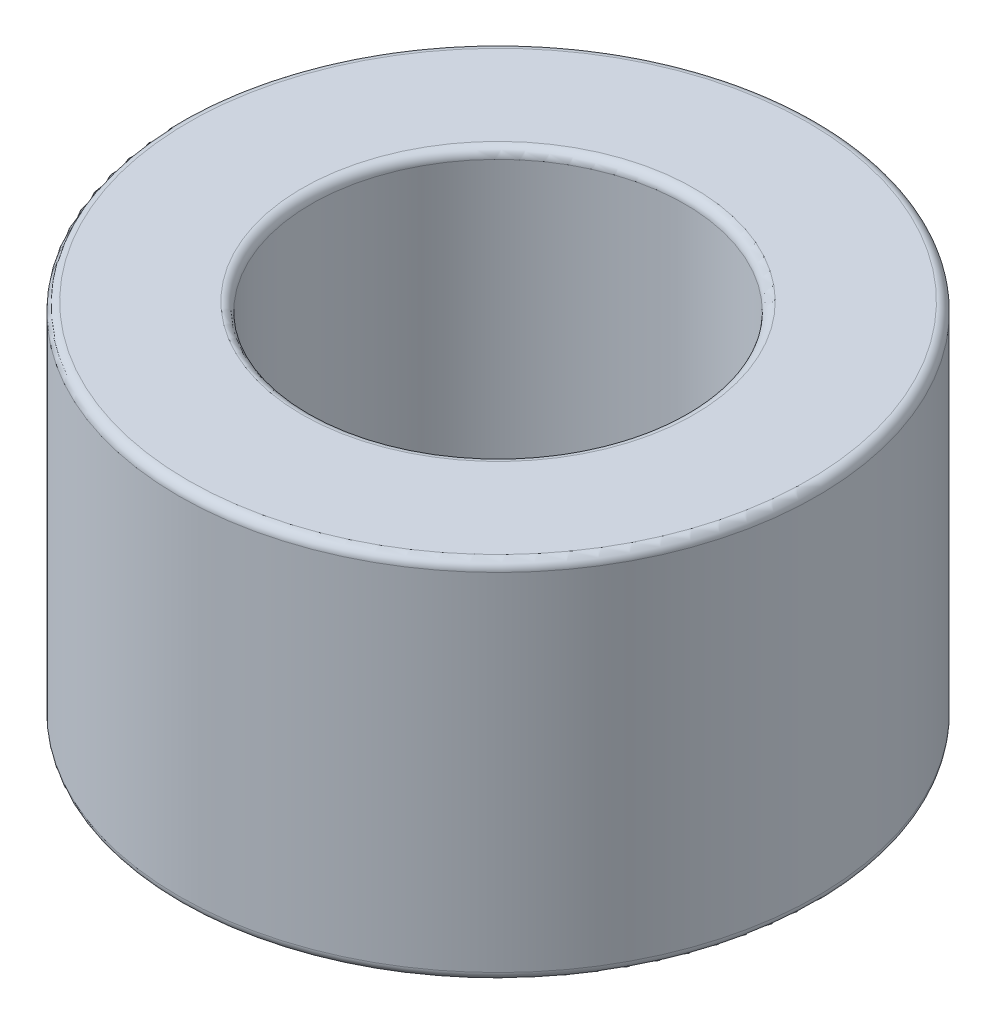
ISO-10303-21;
HEADER;
FILE_DESCRIPTION(('STEP AP214'),'2;1');
FILE_NAME('part.step','',(''),(''),'','','');
FILE_SCHEMA(('AUTOMOTIVE_DESIGN { 1 0 10303 214 1 1 1 1 }'));
ENDSEC;
DATA;
#1=APPLICATION_CONTEXT('core data for automotive mechanical design processes');
#2=APPLICATION_PROTOCOL_DEFINITION('international standard','automotive_design',2000,#1);
#3=PRODUCT_CONTEXT('',#1,'mechanical');
#4=PRODUCT('Part','Part','',(#3));
#5=PRODUCT_RELATED_PRODUCT_CATEGORY('part','',(#4));
#6=PRODUCT_DEFINITION_FORMATION('','',#4);
#7=PRODUCT_DEFINITION_CONTEXT('part definition',#1,'design');
#8=PRODUCT_DEFINITION('design','',#6,#7);
#9=PRODUCT_DEFINITION_SHAPE('','',#8);
#10=(LENGTH_UNIT() NAMED_UNIT(*) SI_UNIT(.MILLI.,.METRE.));
#11=(NAMED_UNIT(*) PLANE_ANGLE_UNIT() SI_UNIT($,.RADIAN.));
#12=(NAMED_UNIT(*) SI_UNIT($,.STERADIAN.) SOLID_ANGLE_UNIT());
#13=UNCERTAINTY_MEASURE_WITH_UNIT(LENGTH_MEASURE(1.E-05),#10,'distance_accuracy_value','');
#14=(GEOMETRIC_REPRESENTATION_CONTEXT(3) GLOBAL_UNCERTAINTY_ASSIGNED_CONTEXT((#13)) GLOBAL_UNIT_ASSIGNED_CONTEXT((#10,
#11,#12)) REPRESENTATION_CONTEXT('',''));
#15=CARTESIAN_POINT('',(0.,0.,0.));
#16=DIRECTION('',(0.,0.,1.));
#17=DIRECTION('',(1.,0.,0.));
#18=AXIS2_PLACEMENT_3D('',#15,#16,#17);
#19=CARTESIAN_POINT('',(0.,4.,0.));
#20=DIRECTION('',(0.,1.,0.));
#21=DIRECTION('',(0.,0.,1.));
#22=AXIS2_PLACEMENT_3D('',#19,#20,#21);
#23=PLANE('',#22);
#24=CARTESIAN_POINT('',(0.,4.,0.));
#25=DIRECTION('',(0.,1.,0.));
#26=DIRECTION('',(0.,0.,1.));
#27=AXIS2_PLACEMENT_3D('',#24,#25,#26);
#28=CIRCLE('',#27,2.15);
#29=CARTESIAN_POINT('',(0.,4.,2.15));
#30=VERTEX_POINT('',#29);
#31=EDGE_CURVE('E52',#30,#30,#28,.F.);
#32=ORIENTED_EDGE('',*,*,#31,.T.);
#33=EDGE_LOOP('',(#32));
#34=FACE_BOUND('',#33,.T.);
#35=CARTESIAN_POINT('',(0.,4.,0.));
#36=DIRECTION('',(0.,1.,0.));
#37=DIRECTION('',(0.,0.,1.));
#38=AXIS2_PLACEMENT_3D('',#35,#36,#37);
#39=CIRCLE('',#38,3.4);
#40=CARTESIAN_POINT('',(0.,4.,3.4));
#41=VERTEX_POINT('',#40);
#42=EDGE_CURVE('E57',#41,#41,#39,.T.);
#43=ORIENTED_EDGE('',*,*,#42,.T.);
#44=EDGE_LOOP('',(#43));
#45=FACE_BOUND('',#44,.T.);
#46=ADVANCED_FACE('F37',(#34,#45),#23,.T.);
#47=CARTESIAN_POINT('',(0.,0.,0.));
#48=DIRECTION('',(0.,1.,0.));
#49=DIRECTION('',(0.,0.,1.));
#50=AXIS2_PLACEMENT_3D('',#47,#48,#49);
#51=PLANE('',#50);
#52=CARTESIAN_POINT('',(0.,0.,0.));
#53=DIRECTION('',(0.,1.,0.));
#54=DIRECTION('',(0.,0.,1.));
#55=AXIS2_PLACEMENT_3D('',#52,#53,#54);
#56=CIRCLE('',#55,3.4);
#57=CARTESIAN_POINT('',(0.,0.,3.4));
#58=VERTEX_POINT('',#57);
#59=EDGE_CURVE('E10',#58,#58,#56,.F.);
#60=ORIENTED_EDGE('',*,*,#59,.T.);
#61=EDGE_LOOP('',(#60));
#62=FACE_BOUND('',#61,.T.);
#63=CARTESIAN_POINT('',(0.,0.,0.));
#64=DIRECTION('',(0.,1.,0.));
#65=DIRECTION('',(0.,0.,1.));
#66=AXIS2_PLACEMENT_3D('',#63,#64,#65);
#67=CIRCLE('',#66,2.05);
#68=CARTESIAN_POINT('',(0.,0.,2.05));
#69=VERTEX_POINT('',#68);
#70=EDGE_CURVE('E63',#69,#69,#67,.T.);
#71=ORIENTED_EDGE('',*,*,#70,.T.);
#72=EDGE_LOOP('',(#71));
#73=FACE_BOUND('',#72,.T.);
#74=ADVANCED_FACE('F67',(#62,#73),#51,.F.);
#75=CARTESIAN_POINT('',(0.,4.,0.));
#76=DIRECTION('',(0.,-1.,0.));
#77=DIRECTION('',(0.,0.,-1.));
#78=AXIS2_PLACEMENT_3D('',#75,#76,#77);
#79=CYLINDRICAL_SURFACE('',#78,3.5);
#80=CARTESIAN_POINT('',(0.,0.0999999999999998,0.));
#81=DIRECTION('',(0.,1.,0.));
#82=DIRECTION('',(0.,0.,1.));
#83=AXIS2_PLACEMENT_3D('',#80,#81,#82);
#84=CIRCLE('',#83,3.5);
#85=CARTESIAN_POINT('',(0.,0.0999999999999998,3.5));
#86=VERTEX_POINT('',#85);
#87=EDGE_CURVE('E44',#86,#86,#84,.T.);
#88=ORIENTED_EDGE('',*,*,#87,.T.);
#89=EDGE_LOOP('',(#88));
#90=FACE_BOUND('',#89,.T.);
#91=CARTESIAN_POINT('',(0.,3.9,0.));
#92=DIRECTION('',(0.,1.,0.));
#93=DIRECTION('',(0.,0.,1.));
#94=AXIS2_PLACEMENT_3D('',#91,#92,#93);
#95=CIRCLE('',#94,3.5);
#96=CARTESIAN_POINT('',(0.,3.9,3.5));
#97=VERTEX_POINT('',#96);
#98=EDGE_CURVE('E48',#97,#97,#95,.F.);
#99=ORIENTED_EDGE('',*,*,#98,.T.);
#100=EDGE_LOOP('',(#99));
#101=FACE_BOUND('',#100,.T.);
#102=ADVANCED_FACE('F72',(#90,#101),#79,.T.);
#103=CARTESIAN_POINT('',(0.,4.,0.));
#104=DIRECTION('',(0.,-1.,0.));
#105=DIRECTION('',(0.,0.,-1.));
#106=AXIS2_PLACEMENT_3D('',#103,#104,#105);
#107=CYLINDRICAL_SURFACE('',#106,2.05);
#108=CARTESIAN_POINT('',(0.,3.9,0.));
#109=DIRECTION('',(0.,1.,0.));
#110=DIRECTION('',(0.,0.,1.));
#111=AXIS2_PLACEMENT_3D('',#108,#109,#110);
#112=CIRCLE('',#111,2.05);
#113=CARTESIAN_POINT('',(0.,3.9,2.05));
#114=VERTEX_POINT('',#113);
#115=EDGE_CURVE('E60',#114,#114,#112,.T.);
#116=ORIENTED_EDGE('',*,*,#115,.T.);
#117=EDGE_LOOP('',(#116));
#118=FACE_BOUND('',#117,.T.);
#119=ORIENTED_EDGE('',*,*,#70,.F.);
#120=EDGE_LOOP('',(#119));
#121=FACE_BOUND('',#120,.T.);
#122=ADVANCED_FACE('F69',(#118,#121),#107,.F.);
#123=CARTESIAN_POINT('',(0.,3.9,0.));
#124=DIRECTION('',(0.,1.,0.));
#125=DIRECTION('',(0.,0.,1.));
#126=AXIS2_PLACEMENT_3D('',#123,#124,#125);
#127=TOROIDAL_SURFACE('',#126,2.15,0.1);
#128=ORIENTED_EDGE('',*,*,#31,.F.);
#129=EDGE_LOOP('',(#128));
#130=FACE_BOUND('',#129,.T.);
#131=ORIENTED_EDGE('',*,*,#115,.F.);
#132=EDGE_LOOP('',(#131));
#133=FACE_BOUND('',#132,.T.);
#134=ADVANCED_FACE('F71',(#130,#133),#127,.T.);
#135=CARTESIAN_POINT('',(0.,0.0999999999999998,0.));
#136=DIRECTION('',(0.,1.,0.));
#137=DIRECTION('',(0.,0.,1.));
#138=AXIS2_PLACEMENT_3D('',#135,#136,#137);
#139=TOROIDAL_SURFACE('',#138,3.4,0.1);
#140=ORIENTED_EDGE('',*,*,#59,.F.);
#141=EDGE_LOOP('',(#140));
#142=FACE_BOUND('',#141,.T.);
#143=ORIENTED_EDGE('',*,*,#87,.F.);
#144=EDGE_LOOP('',(#143));
#145=FACE_BOUND('',#144,.T.);
#146=ADVANCED_FACE('F79',(#142,#145),#139,.T.);
#147=CARTESIAN_POINT('',(0.,3.9,0.));
#148=DIRECTION('',(0.,1.,0.));
#149=DIRECTION('',(0.,0.,1.));
#150=AXIS2_PLACEMENT_3D('',#147,#148,#149);
#151=TOROIDAL_SURFACE('',#150,3.4,0.1);
#152=ORIENTED_EDGE('',*,*,#98,.F.);
#153=EDGE_LOOP('',(#152));
#154=FACE_BOUND('',#153,.T.);
#155=ORIENTED_EDGE('',*,*,#42,.F.);
#156=EDGE_LOOP('',(#155));
#157=FACE_BOUND('',#156,.T.);
#158=ADVANCED_FACE('F39',(#154,#157),#151,.T.);
#159=CLOSED_SHELL('',(#46,#74,#102,#122,#134,#146,#158));
#160=MANIFOLD_SOLID_BREP('B2',#159);
#161=ADVANCED_BREP_SHAPE_REPRESENTATION('',(#18,#160),#14);
#162=SHAPE_DEFINITION_REPRESENTATION(#9,#161);
ENDSEC;
END-ISO-10303-21;
